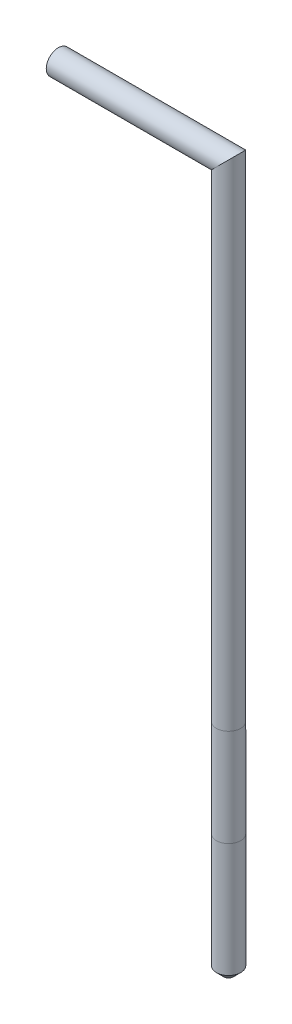
ISO-10303-21;
HEADER;
FILE_DESCRIPTION(('STEP AP214'),'2;1');
FILE_NAME('part.step','',(''),(''),'','','');
FILE_SCHEMA(('AUTOMOTIVE_DESIGN { 1 0 10303 214 1 1 1 1 }'));
ENDSEC;
DATA;
#1=APPLICATION_CONTEXT('core data for automotive mechanical design processes');
#2=APPLICATION_PROTOCOL_DEFINITION('international standard','automotive_design',2000,#1);
#3=PRODUCT_CONTEXT('',#1,'mechanical');
#4=PRODUCT('Part','Part','',(#3));
#5=PRODUCT_RELATED_PRODUCT_CATEGORY('part','',(#4));
#6=PRODUCT_DEFINITION_FORMATION('','',#4);
#7=PRODUCT_DEFINITION_CONTEXT('part definition',#1,'design');
#8=PRODUCT_DEFINITION('design','',#6,#7);
#9=PRODUCT_DEFINITION_SHAPE('','',#8);
#10=(LENGTH_UNIT() NAMED_UNIT(*) SI_UNIT(.MILLI.,.METRE.));
#11=(NAMED_UNIT(*) PLANE_ANGLE_UNIT() SI_UNIT($,.RADIAN.));
#12=(NAMED_UNIT(*) SI_UNIT($,.STERADIAN.) SOLID_ANGLE_UNIT());
#13=UNCERTAINTY_MEASURE_WITH_UNIT(LENGTH_MEASURE(1.E-05),#10,'distance_accuracy_value','');
#14=(GEOMETRIC_REPRESENTATION_CONTEXT(3) GLOBAL_UNCERTAINTY_ASSIGNED_CONTEXT((#13)) GLOBAL_UNIT_ASSIGNED_CONTEXT((#10,
#11,#12)) REPRESENTATION_CONTEXT('',''));
#15=CARTESIAN_POINT('',(0.,0.,0.));
#16=DIRECTION('',(0.,0.,1.));
#17=DIRECTION('',(1.,0.,0.));
#18=AXIS2_PLACEMENT_3D('',#15,#16,#17);
#19=CARTESIAN_POINT('',(0.,-50.,0.));
#20=DIRECTION('',(0.,1.,0.));
#21=DIRECTION('',(0.,0.,1.));
#22=AXIS2_PLACEMENT_3D('',#19,#20,#21);
#23=PLANE('',#22);
#24=CARTESIAN_POINT('',(0.,-50.,0.));
#25=DIRECTION('',(0.,1.,0.));
#26=DIRECTION('',(0.,0.,1.));
#27=AXIS2_PLACEMENT_3D('',#24,#25,#26);
#28=CIRCLE('',#27,2.);
#29=CARTESIAN_POINT('',(0.,-50.,2.));
#30=VERTEX_POINT('',#29);
#31=EDGE_CURVE('E10',#30,#30,#28,.F.);
#32=ORIENTED_EDGE('',*,*,#31,.T.);
#33=EDGE_LOOP('',(#32));
#34=FACE_BOUND('',#33,.T.);
#35=ADVANCED_FACE('F35',(#34),#23,.F.);
#36=CARTESIAN_POINT('',(-70.,240.,0.));
#37=DIRECTION('',(-1.,0.,0.));
#38=DIRECTION('',(0.,0.,1.));
#39=AXIS2_PLACEMENT_3D('',#36,#37,#38);
#40=PLANE('',#39);
#41=CARTESIAN_POINT('',(-70.,240.,0.));
#42=DIRECTION('',(-1.,0.,0.));
#43=DIRECTION('',(0.,0.,1.));
#44=AXIS2_PLACEMENT_3D('',#41,#42,#43);
#45=CIRCLE('',#44,5.);
#46=CARTESIAN_POINT('',(-70.,240.,5.));
#47=VERTEX_POINT('',#46);
#48=EDGE_CURVE('E51',#47,#47,#45,.T.);
#49=ORIENTED_EDGE('',*,*,#48,.T.);
#50=EDGE_LOOP('',(#49));
#51=FACE_BOUND('',#50,.T.);
#52=ADVANCED_FACE('F63',(#51),#40,.T.);
#53=CARTESIAN_POINT('',(0.,251.1,0.));
#54=DIRECTION('',(0.,-1.,0.));
#55=DIRECTION('',(0.,0.,-1.));
#56=AXIS2_PLACEMENT_3D('',#53,#54,#55);
#57=CYLINDRICAL_SURFACE('',#56,5.);
#58=CARTESIAN_POINT('',(0.,240.,0.));
#59=DIRECTION('',(0.707106781186548,-0.707106781186548,0.));
#60=DIRECTION('',(0.707106781186548,0.707106781186548,0.));
#61=AXIS2_PLACEMENT_3D('',#58,#59,#60);
#62=ELLIPSE('',#61,7.07106781186547,5.);
#63=CARTESIAN_POINT('',(5.,245.,0.));
#64=VERTEX_POINT('',#63);
#65=EDGE_CURVE('E47',#64,#64,#62,.T.);
#66=ORIENTED_EDGE('',*,*,#65,.T.);
#67=EDGE_LOOP('',(#66));
#68=FACE_BOUND('',#67,.T.);
#69=CARTESIAN_POINT('',(0.,40.,0.));
#70=DIRECTION('',(0.,1.,0.));
#71=DIRECTION('',(0.,0.,1.));
#72=AXIS2_PLACEMENT_3D('',#69,#70,#71);
#73=CIRCLE('',#72,5.);
#74=CARTESIAN_POINT('',(0.,40.,5.));
#75=VERTEX_POINT('',#74);
#76=EDGE_CURVE('E54',#75,#75,#73,.T.);
#77=ORIENTED_EDGE('',*,*,#76,.T.);
#78=EDGE_LOOP('',(#77));
#79=FACE_BOUND('',#78,.T.);
#80=ADVANCED_FACE('F72',(#68,#79),#57,.T.);
#81=CARTESIAN_POINT('',(0.,40.,0.));
#82=DIRECTION('',(0.,-1.,0.));
#83=DIRECTION('',(0.,0.,-1.));
#84=AXIS2_PLACEMENT_3D('',#81,#82,#83);
#85=CYLINDRICAL_SURFACE('',#84,5.);
#86=CARTESIAN_POINT('',(0.,0.,0.));
#87=DIRECTION('',(0.,1.,0.));
#88=DIRECTION('',(0.,0.,1.));
#89=AXIS2_PLACEMENT_3D('',#86,#87,#88);
#90=CIRCLE('',#89,5.);
#91=CARTESIAN_POINT('',(0.,0.,5.));
#92=VERTEX_POINT('',#91);
#93=EDGE_CURVE('E57',#92,#92,#90,.T.);
#94=ORIENTED_EDGE('',*,*,#93,.T.);
#95=EDGE_LOOP('',(#94));
#96=FACE_BOUND('',#95,.T.);
#97=ORIENTED_EDGE('',*,*,#76,.F.);
#98=EDGE_LOOP('',(#97));
#99=FACE_BOUND('',#98,.T.);
#100=ADVANCED_FACE('F75',(#96,#99),#85,.T.);
#101=CARTESIAN_POINT('',(0.,0.,0.));
#102=DIRECTION('',(0.,-1.,0.));
#103=DIRECTION('',(0.,0.,-1.));
#104=AXIS2_PLACEMENT_3D('',#101,#102,#103);
#105=CYLINDRICAL_SURFACE('',#104,5.);
#106=CARTESIAN_POINT('',(0.,-47.,0.));
#107=DIRECTION('',(0.,1.,0.));
#108=DIRECTION('',(0.,0.,1.));
#109=AXIS2_PLACEMENT_3D('',#106,#107,#108);
#110=CIRCLE('',#109,5.);
#111=CARTESIAN_POINT('',(0.,-47.,5.));
#112=VERTEX_POINT('',#111);
#113=EDGE_CURVE('E43',#112,#112,#110,.T.);
#114=ORIENTED_EDGE('',*,*,#113,.T.);
#115=EDGE_LOOP('',(#114));
#116=FACE_BOUND('',#115,.T.);
#117=ORIENTED_EDGE('',*,*,#93,.F.);
#118=EDGE_LOOP('',(#117));
#119=FACE_BOUND('',#118,.T.);
#120=ADVANCED_FACE('F68',(#116,#119),#105,.T.);
#121=CARTESIAN_POINT('',(-70.,240.,0.));
#122=DIRECTION('',(1.,0.,0.));
#123=DIRECTION('',(0.,0.,-1.));
#124=AXIS2_PLACEMENT_3D('',#121,#122,#123);
#125=CYLINDRICAL_SURFACE('',#124,5.);
#126=ORIENTED_EDGE('',*,*,#48,.F.);
#127=EDGE_LOOP('',(#126));
#128=FACE_BOUND('',#127,.T.);
#129=ORIENTED_EDGE('',*,*,#65,.F.);
#130=EDGE_LOOP('',(#129));
#131=FACE_BOUND('',#130,.T.);
#132=ADVANCED_FACE('F65',(#128,#131),#125,.T.);
#133=CARTESIAN_POINT('',(0.,-47.,0.));
#134=DIRECTION('',(0.,1.,0.));
#135=DIRECTION('',(0.,0.,1.));
#136=AXIS2_PLACEMENT_3D('',#133,#134,#135);
#137=CONICAL_SURFACE('',#136,5.,0.785398163397453);
#138=ORIENTED_EDGE('',*,*,#31,.F.);
#139=EDGE_LOOP('',(#138));
#140=FACE_BOUND('',#139,.T.);
#141=ORIENTED_EDGE('',*,*,#113,.F.);
#142=EDGE_LOOP('',(#141));
#143=FACE_BOUND('',#142,.T.);
#144=ADVANCED_FACE('F38',(#140,#143),#137,.T.);
#145=CLOSED_SHELL('',(#35,#52,#80,#100,#120,#132,#144));
#146=MANIFOLD_SOLID_BREP('B2',#145);
#147=ADVANCED_BREP_SHAPE_REPRESENTATION('',(#18,#146),#14);
#148=SHAPE_DEFINITION_REPRESENTATION(#9,#147);
ENDSEC;
END-ISO-10303-21;
